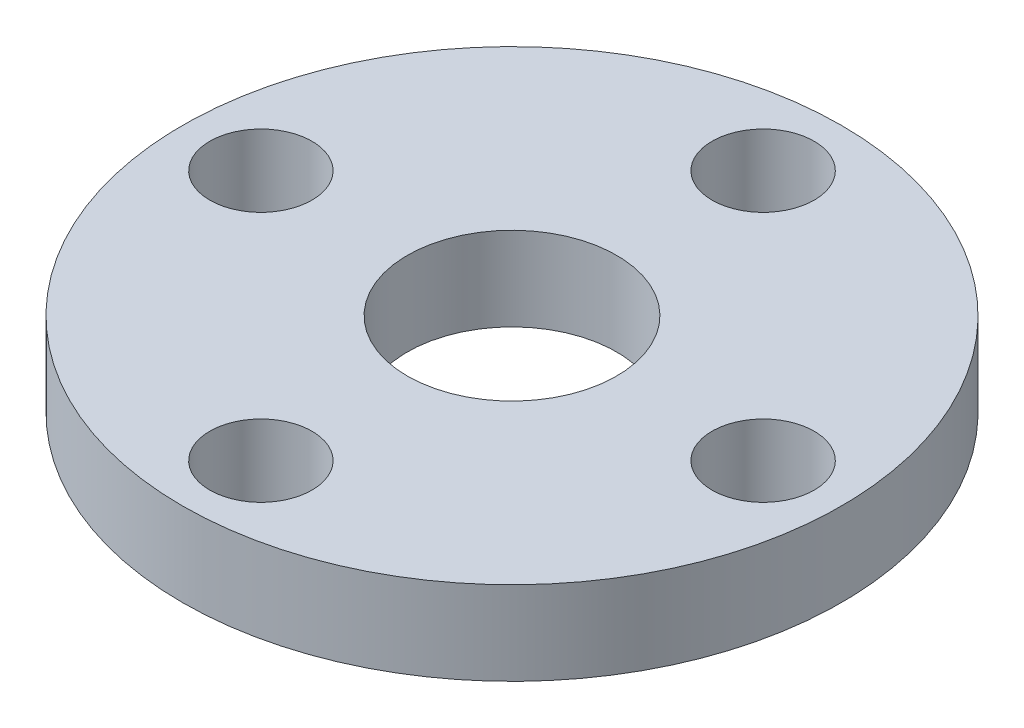
ISO-10303-21;
HEADER;
FILE_DESCRIPTION(('STEP AP214'),'2;1');
FILE_NAME('part.step','',(''),(''),'','','');
FILE_SCHEMA(('AUTOMOTIVE_DESIGN { 1 0 10303 214 1 1 1 1 }'));
ENDSEC;
DATA;
#1=APPLICATION_CONTEXT('core data for automotive mechanical design processes');
#2=APPLICATION_PROTOCOL_DEFINITION('international standard','automotive_design',2000,#1);
#3=PRODUCT_CONTEXT('',#1,'mechanical');
#4=PRODUCT('Part','Part','',(#3));
#5=PRODUCT_RELATED_PRODUCT_CATEGORY('part','',(#4));
#6=PRODUCT_DEFINITION_FORMATION('','',#4);
#7=PRODUCT_DEFINITION_CONTEXT('part definition',#1,'design');
#8=PRODUCT_DEFINITION('design','',#6,#7);
#9=PRODUCT_DEFINITION_SHAPE('','',#8);
#10=(LENGTH_UNIT() NAMED_UNIT(*) SI_UNIT(.MILLI.,.METRE.));
#11=(NAMED_UNIT(*) PLANE_ANGLE_UNIT() SI_UNIT($,.RADIAN.));
#12=(NAMED_UNIT(*) SI_UNIT($,.STERADIAN.) SOLID_ANGLE_UNIT());
#13=UNCERTAINTY_MEASURE_WITH_UNIT(LENGTH_MEASURE(1.E-05),#10,'distance_accuracy_value','');
#14=(GEOMETRIC_REPRESENTATION_CONTEXT(3) GLOBAL_UNCERTAINTY_ASSIGNED_CONTEXT((#13)) GLOBAL_UNIT_ASSIGNED_CONTEXT((#10,
#11,#12)) REPRESENTATION_CONTEXT('',''));
#15=CARTESIAN_POINT('',(0.,0.,0.));
#16=DIRECTION('',(0.,0.,1.));
#17=DIRECTION('',(1.,0.,0.));
#18=AXIS2_PLACEMENT_3D('',#15,#16,#17);
#19=CARTESIAN_POINT('',(0.,2.54,0.));
#20=DIRECTION('',(0.,1.,0.));
#21=DIRECTION('',(0.,0.,1.));
#22=AXIS2_PLACEMENT_3D('',#19,#20,#21);
#23=PLANE('',#22);
#24=CARTESIAN_POINT('',(2.30323026412675E-11,2.54,7.62));
#25=DIRECTION('',(0.,1.,0.));
#26=DIRECTION('',(0.,0.,1.));
#27=AXIS2_PLACEMENT_3D('',#24,#25,#26);
#28=CIRCLE('',#27,1.55);
#29=CARTESIAN_POINT('',(2.30323026412675E-11,2.54,9.17));
#30=VERTEX_POINT('',#29);
#31=EDGE_CURVE('E63',#30,#30,#28,.T.);
#32=ORIENTED_EDGE('',*,*,#31,.F.);
#33=EDGE_LOOP('',(#32));
#34=FACE_BOUND('',#33,.T.);
#35=CARTESIAN_POINT('',(0.,2.54,-7.62));
#36=DIRECTION('',(0.,1.,0.));
#37=DIRECTION('',(0.,0.,1.));
#38=AXIS2_PLACEMENT_3D('',#35,#36,#37);
#39=CIRCLE('',#38,1.55);
#40=CARTESIAN_POINT('',(0.,2.54,-6.07));
#41=VERTEX_POINT('',#40);
#42=EDGE_CURVE('E51',#41,#41,#39,.T.);
#43=ORIENTED_EDGE('',*,*,#42,.F.);
#44=EDGE_LOOP('',(#43));
#45=FACE_BOUND('',#44,.T.);
#46=CARTESIAN_POINT('',(0.,2.54,0.));
#47=DIRECTION('',(0.,1.,0.));
#48=DIRECTION('',(0.,0.,1.));
#49=AXIS2_PLACEMENT_3D('',#46,#47,#48);
#50=CIRCLE('',#49,10.);
#51=CARTESIAN_POINT('',(0.,2.54,10.));
#52=VERTEX_POINT('',#51);
#53=EDGE_CURVE('E10',#52,#52,#50,.T.);
#54=ORIENTED_EDGE('',*,*,#53,.T.);
#55=EDGE_LOOP('',(#54));
#56=FACE_BOUND('',#55,.T.);
#57=CARTESIAN_POINT('',(0.,2.54,0.));
#58=DIRECTION('',(0.,1.,0.));
#59=DIRECTION('',(0.,0.,1.));
#60=AXIS2_PLACEMENT_3D('',#57,#58,#59);
#61=CIRCLE('',#60,3.175);
#62=CARTESIAN_POINT('',(0.,2.54,3.175));
#63=VERTEX_POINT('',#62);
#64=EDGE_CURVE('E46',#63,#63,#61,.T.);
#65=ORIENTED_EDGE('',*,*,#64,.F.);
#66=EDGE_LOOP('',(#65));
#67=FACE_BOUND('',#66,.T.);
#68=CARTESIAN_POINT('',(7.62000000001152,2.54,-1.1515201900002E-11));
#69=DIRECTION('',(0.,1.,0.));
#70=DIRECTION('',(0.,0.,1.));
#71=AXIS2_PLACEMENT_3D('',#68,#69,#70);
#72=CIRCLE('',#71,1.55);
#73=CARTESIAN_POINT('',(7.62000000001152,2.54,1.54999999998848));
#74=VERTEX_POINT('',#73);
#75=EDGE_CURVE('E57',#74,#74,#72,.T.);
#76=ORIENTED_EDGE('',*,*,#75,.F.);
#77=EDGE_LOOP('',(#76));
#78=FACE_BOUND('',#77,.T.);
#79=CARTESIAN_POINT('',(-7.61999999998848,2.54,1.15161350808629E-11));
#80=DIRECTION('',(0.,1.,0.));
#81=DIRECTION('',(0.,0.,1.));
#82=AXIS2_PLACEMENT_3D('',#79,#80,#81);
#83=CIRCLE('',#82,1.55);
#84=CARTESIAN_POINT('',(-7.61999999998848,2.54,1.55000000001152));
#85=VERTEX_POINT('',#84);
#86=EDGE_CURVE('E69',#85,#85,#83,.T.);
#87=ORIENTED_EDGE('',*,*,#86,.F.);
#88=EDGE_LOOP('',(#87));
#89=FACE_BOUND('',#88,.T.);
#90=ADVANCED_FACE('F35',(#34,#45,#56,#67,#78,#89),#23,.T.);
#91=CARTESIAN_POINT('',(0.,0.,0.));
#92=DIRECTION('',(0.,1.,0.));
#93=DIRECTION('',(0.,0.,1.));
#94=AXIS2_PLACEMENT_3D('',#91,#92,#93);
#95=PLANE('',#94);
#96=CARTESIAN_POINT('',(0.,0.,0.));
#97=DIRECTION('',(0.,1.,0.));
#98=DIRECTION('',(0.,0.,1.));
#99=AXIS2_PLACEMENT_3D('',#96,#97,#98);
#100=CIRCLE('',#99,10.);
#101=CARTESIAN_POINT('',(0.,0.,10.));
#102=VERTEX_POINT('',#101);
#103=EDGE_CURVE('E39',#102,#102,#100,.T.);
#104=ORIENTED_EDGE('',*,*,#103,.F.);
#105=EDGE_LOOP('',(#104));
#106=FACE_BOUND('',#105,.T.);
#107=CARTESIAN_POINT('',(0.,0.,0.));
#108=DIRECTION('',(0.,1.,0.));
#109=DIRECTION('',(0.,0.,1.));
#110=AXIS2_PLACEMENT_3D('',#107,#108,#109);
#111=CIRCLE('',#110,3.175);
#112=CARTESIAN_POINT('',(0.,0.,3.175));
#113=VERTEX_POINT('',#112);
#114=EDGE_CURVE('E48',#113,#113,#111,.T.);
#115=ORIENTED_EDGE('',*,*,#114,.T.);
#116=EDGE_LOOP('',(#115));
#117=FACE_BOUND('',#116,.T.);
#118=CARTESIAN_POINT('',(0.,0.,-7.62));
#119=DIRECTION('',(0.,1.,0.));
#120=DIRECTION('',(0.,0.,1.));
#121=AXIS2_PLACEMENT_3D('',#118,#119,#120);
#122=CIRCLE('',#121,1.55);
#123=CARTESIAN_POINT('',(0.,0.,-6.07));
#124=VERTEX_POINT('',#123);
#125=EDGE_CURVE('E54',#124,#124,#122,.T.);
#126=ORIENTED_EDGE('',*,*,#125,.T.);
#127=EDGE_LOOP('',(#126));
#128=FACE_BOUND('',#127,.T.);
#129=CARTESIAN_POINT('',(7.62000000001152,0.,-1.1515201900002E-11));
#130=DIRECTION('',(0.,1.,0.));
#131=DIRECTION('',(0.,0.,1.));
#132=AXIS2_PLACEMENT_3D('',#129,#130,#131);
#133=CIRCLE('',#132,1.55);
#134=CARTESIAN_POINT('',(7.62000000001152,0.,1.54999999998848));
#135=VERTEX_POINT('',#134);
#136=EDGE_CURVE('E60',#135,#135,#133,.T.);
#137=ORIENTED_EDGE('',*,*,#136,.T.);
#138=EDGE_LOOP('',(#137));
#139=FACE_BOUND('',#138,.T.);
#140=CARTESIAN_POINT('',(2.30323026412675E-11,0.,7.62));
#141=DIRECTION('',(0.,1.,0.));
#142=DIRECTION('',(0.,0.,1.));
#143=AXIS2_PLACEMENT_3D('',#140,#141,#142);
#144=CIRCLE('',#143,1.55);
#145=CARTESIAN_POINT('',(2.30323026412675E-11,0.,9.17));
#146=VERTEX_POINT('',#145);
#147=EDGE_CURVE('E66',#146,#146,#144,.T.);
#148=ORIENTED_EDGE('',*,*,#147,.T.);
#149=EDGE_LOOP('',(#148));
#150=FACE_BOUND('',#149,.T.);
#151=CARTESIAN_POINT('',(-7.61999999998848,0.,1.15161350808629E-11));
#152=DIRECTION('',(0.,1.,0.));
#153=DIRECTION('',(0.,0.,1.));
#154=AXIS2_PLACEMENT_3D('',#151,#152,#153);
#155=CIRCLE('',#154,1.55);
#156=CARTESIAN_POINT('',(-7.61999999998848,0.,1.55000000001152));
#157=VERTEX_POINT('',#156);
#158=EDGE_CURVE('E72',#157,#157,#155,.T.);
#159=ORIENTED_EDGE('',*,*,#158,.T.);
#160=EDGE_LOOP('',(#159));
#161=FACE_BOUND('',#160,.T.);
#162=ADVANCED_FACE('F82',(#106,#117,#128,#139,#150,#161),#95,.F.);
#163=CARTESIAN_POINT('',(0.,2.54,0.));
#164=DIRECTION('',(0.,-1.,0.));
#165=DIRECTION('',(0.,0.,-1.));
#166=AXIS2_PLACEMENT_3D('',#163,#164,#165);
#167=CYLINDRICAL_SURFACE('',#166,10.);
#168=ORIENTED_EDGE('',*,*,#53,.F.);
#169=EDGE_LOOP('',(#168));
#170=FACE_BOUND('',#169,.T.);
#171=ORIENTED_EDGE('',*,*,#103,.T.);
#172=EDGE_LOOP('',(#171));
#173=FACE_BOUND('',#172,.T.);
#174=ADVANCED_FACE('F37',(#170,#173),#167,.T.);
#175=CARTESIAN_POINT('',(0.,2.54,0.));
#176=DIRECTION('',(0.,-1.,0.));
#177=DIRECTION('',(0.,0.,-1.));
#178=AXIS2_PLACEMENT_3D('',#175,#176,#177);
#179=CYLINDRICAL_SURFACE('',#178,3.175);
#180=ORIENTED_EDGE('',*,*,#64,.T.);
#181=EDGE_LOOP('',(#180));
#182=FACE_BOUND('',#181,.T.);
#183=ORIENTED_EDGE('',*,*,#114,.F.);
#184=EDGE_LOOP('',(#183));
#185=FACE_BOUND('',#184,.T.);
#186=ADVANCED_FACE('F92',(#182,#185),#179,.F.);
#187=CARTESIAN_POINT('',(0.,2.54,-7.62));
#188=DIRECTION('',(0.,-1.,0.));
#189=DIRECTION('',(0.,0.,-1.));
#190=AXIS2_PLACEMENT_3D('',#187,#188,#189);
#191=CYLINDRICAL_SURFACE('',#190,1.55);
#192=ORIENTED_EDGE('',*,*,#42,.T.);
#193=EDGE_LOOP('',(#192));
#194=FACE_BOUND('',#193,.T.);
#195=ORIENTED_EDGE('',*,*,#125,.F.);
#196=EDGE_LOOP('',(#195));
#197=FACE_BOUND('',#196,.T.);
#198=ADVANCED_FACE('F95',(#194,#197),#191,.F.);
#199=CARTESIAN_POINT('',(7.62000000001152,2.54,-1.1515201900002E-11));
#200=DIRECTION('',(0.,-1.,0.));
#201=DIRECTION('',(0.,0.,-1.));
#202=AXIS2_PLACEMENT_3D('',#199,#200,#201);
#203=CYLINDRICAL_SURFACE('',#202,1.55);
#204=ORIENTED_EDGE('',*,*,#75,.T.);
#205=EDGE_LOOP('',(#204));
#206=FACE_BOUND('',#205,.T.);
#207=ORIENTED_EDGE('',*,*,#136,.F.);
#208=EDGE_LOOP('',(#207));
#209=FACE_BOUND('',#208,.T.);
#210=ADVANCED_FACE('F99',(#206,#209),#203,.F.);
#211=CARTESIAN_POINT('',(2.30323026412675E-11,2.54,7.62));
#212=DIRECTION('',(0.,-1.,0.));
#213=DIRECTION('',(0.,0.,-1.));
#214=AXIS2_PLACEMENT_3D('',#211,#212,#213);
#215=CYLINDRICAL_SURFACE('',#214,1.55);
#216=ORIENTED_EDGE('',*,*,#31,.T.);
#217=EDGE_LOOP('',(#216));
#218=FACE_BOUND('',#217,.T.);
#219=ORIENTED_EDGE('',*,*,#147,.F.);
#220=EDGE_LOOP('',(#219));
#221=FACE_BOUND('',#220,.T.);
#222=ADVANCED_FACE('F103',(#218,#221),#215,.F.);
#223=CARTESIAN_POINT('',(-7.61999999998848,2.54,1.15161350808629E-11));
#224=DIRECTION('',(0.,-1.,0.));
#225=DIRECTION('',(0.,0.,-1.));
#226=AXIS2_PLACEMENT_3D('',#223,#224,#225);
#227=CYLINDRICAL_SURFACE('',#226,1.55);
#228=ORIENTED_EDGE('',*,*,#86,.T.);
#229=EDGE_LOOP('',(#228));
#230=FACE_BOUND('',#229,.T.);
#231=ORIENTED_EDGE('',*,*,#158,.F.);
#232=EDGE_LOOP('',(#231));
#233=FACE_BOUND('',#232,.T.);
#234=ADVANCED_FACE('F78',(#230,#233),#227,.F.);
#235=CLOSED_SHELL('',(#90,#162,#174,#186,#198,#210,#222,#234));
#236=MANIFOLD_SOLID_BREP('B2',#235);
#237=ADVANCED_BREP_SHAPE_REPRESENTATION('',(#18,#236),#14);
#238=SHAPE_DEFINITION_REPRESENTATION(#9,#237);
ENDSEC;
END-ISO-10303-21;
